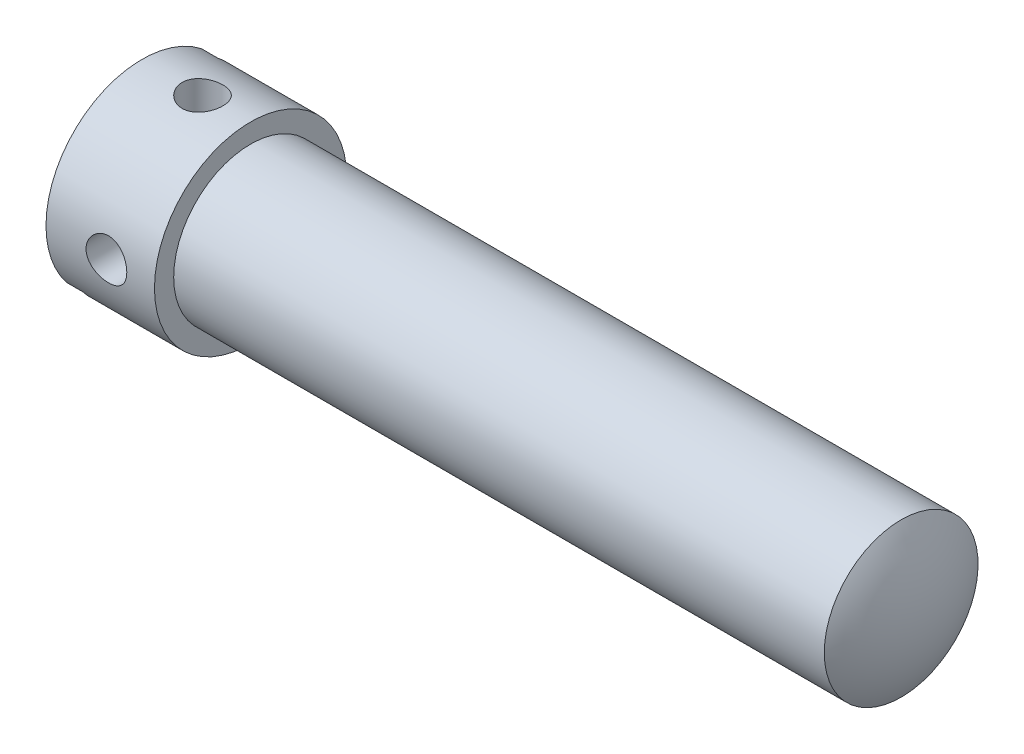
ISO-10303-21;
HEADER;
FILE_DESCRIPTION(('STEP AP214'),'2;1');
FILE_NAME('part.step','',(''),(''),'','','');
FILE_SCHEMA(('AUTOMOTIVE_DESIGN { 1 0 10303 214 1 1 1 1 }'));
ENDSEC;
DATA;
#1=APPLICATION_CONTEXT('core data for automotive mechanical design processes');
#2=APPLICATION_PROTOCOL_DEFINITION('international standard','automotive_design',2000,#1);
#3=PRODUCT_CONTEXT('',#1,'mechanical');
#4=PRODUCT('Part','Part','',(#3));
#5=PRODUCT_RELATED_PRODUCT_CATEGORY('part','',(#4));
#6=PRODUCT_DEFINITION_FORMATION('','',#4);
#7=PRODUCT_DEFINITION_CONTEXT('part definition',#1,'design');
#8=PRODUCT_DEFINITION('design','',#6,#7);
#9=PRODUCT_DEFINITION_SHAPE('','',#8);
#10=(LENGTH_UNIT() NAMED_UNIT(*) SI_UNIT(.MILLI.,.METRE.));
#11=(NAMED_UNIT(*) PLANE_ANGLE_UNIT() SI_UNIT($,.RADIAN.));
#12=(NAMED_UNIT(*) SI_UNIT($,.STERADIAN.) SOLID_ANGLE_UNIT());
#13=UNCERTAINTY_MEASURE_WITH_UNIT(LENGTH_MEASURE(1.E-05),#10,'distance_accuracy_value','');
#14=(GEOMETRIC_REPRESENTATION_CONTEXT(3) GLOBAL_UNCERTAINTY_ASSIGNED_CONTEXT((#13)) GLOBAL_UNIT_ASSIGNED_CONTEXT((#10,
#11,#12)) REPRESENTATION_CONTEXT('',''));
#15=CARTESIAN_POINT('',(0.,0.,0.));
#16=DIRECTION('',(0.,0.,1.));
#17=DIRECTION('',(1.,0.,0.));
#18=AXIS2_PLACEMENT_3D('',#15,#16,#17);
#19=CARTESIAN_POINT('',(12.5255923651299,-1.80873382528711E-06,1.02256343965393E-06));
#20=DIRECTION('',(-1.,0.,0.));
#21=DIRECTION('',(0.,1.,0.));
#22=AXIS2_PLACEMENT_3D('',#19,#20,#21);
#23=SPHERICAL_SURFACE('',#22,22.5);
#24=CARTESIAN_POINT('',(-8.68761107046652,-1.80873382528711E-06,1.02256343965393E-06));
#25=DIRECTION('',(-1.,0.,0.));
#26=DIRECTION('',(0.,0.,1.));
#27=AXIS2_PLACEMENT_3D('',#24,#25,#26);
#28=CIRCLE('',#27,7.5);
#29=CARTESIAN_POINT('',(-8.68761107046652,-4.62858433810122,5.90137575806659));
#30=VERTEX_POINT('',#29);
#31=CARTESIAN_POINT('',(-8.68761107046652,5.90137292676935,-4.62858150680394));
#32=VERTEX_POINT('',#31);
#33=EDGE_CURVE('E179',#30,#32,#28,.T.);
#34=ORIENTED_EDGE('',*,*,#33,.T.);
#35=CARTESIAN_POINT('',(12.5255923651299,0.636394294334063,0.636397125631331));
#36=DIRECTION('',(0.,0.707106781186546,0.707106781186549));
#37=DIRECTION('',(0.,-0.707106781186549,0.707106781186546));
#38=AXIS2_PLACEMENT_3D('',#35,#36,#37);
#39=CIRCLE('',#38,22.4819927942342);
#40=EDGE_CURVE('E200',#32,#30,#39,.T.);
#41=ORIENTED_EDGE('',*,*,#40,.T.);
#42=EDGE_LOOP('',(#34,#41));
#43=FACE_BOUND('',#42,.T.);
#44=ADVANCED_FACE('F39',(#43),#23,.T.);
#45=CARTESIAN_POINT('',(-3.9744076348701,-1.80873382528711E-06,-104.999998977437));
#46=DIRECTION('',(0.,0.,1.));
#47=DIRECTION('',(1.,0.,0.));
#48=AXIS2_PLACEMENT_3D('',#45,#46,#47);
#49=CYLINDRICAL_SURFACE('',#48,1.59);
#50=CARTESIAN_POINT('',(-2.3844076348701,-1.80873382528711E-06,7.50000102256344));
#51=CARTESIAN_POINT('',(-2.38441073898803,-0.088254401886171,7.49999938911071));
#52=CARTESIAN_POINT('',(-2.39178011044394,-0.176545128764989,7.4984274306827));
#53=CARTESIAN_POINT('',(-2.42103494369538,-0.350623227488517,7.49230833111322));
#54=CARTESIAN_POINT('',(-2.44293120603099,-0.436408687120695,7.48775897635331));
#55=CARTESIAN_POINT('',(-2.50052677275435,-0.60293489584506,7.47619216107444));
#56=CARTESIAN_POINT('',(-2.5362120977931,-0.683680658192716,7.4691772008348));
#57=CARTESIAN_POINT('',(-2.62032947240995,-0.838035017028102,7.45343830215929));
#58=CARTESIAN_POINT('',(-2.66876103521309,-0.911643885924775,7.44471442898952));
#59=CARTESIAN_POINT('',(-2.7777718607256,-1.05075223161289,7.42636749472083));
#60=CARTESIAN_POINT('',(-2.83850688441345,-1.11612826306031,7.41673384818194));
#61=CARTESIAN_POINT('',(-2.97006602815569,-1.23584530589926,7.39772861075784));
#62=CARTESIAN_POINT('',(-3.04089100433876,-1.29018537994397,7.38835704219065));
#63=CARTESIAN_POINT('',(-3.19152320019655,-1.38682555808829,7.3708330645186));
#64=CARTESIAN_POINT('',(-3.2714156036173,-1.42899556980312,7.36269424087368));
#65=CARTESIAN_POINT('',(-3.43735361349963,-1.4992644892865,7.34870862887407));
#66=CARTESIAN_POINT('',(-3.52339853064787,-1.52736497055835,7.3428615842281));
#67=CARTESIAN_POINT('',(-3.69786393466929,-1.56829183677486,7.33422911274715));
#68=CARTESIAN_POINT('',(-3.78623111480583,-1.58133606678253,7.33140006600798));
#69=CARTESIAN_POINT('',(-3.96394146216113,-1.59245725402556,7.32899279753772));
#70=CARTESIAN_POINT('',(-4.05328451572747,-1.59053593600841,7.32941420119911));
#71=CARTESIAN_POINT('',(-4.22880053976759,-1.57195617760203,7.33342067701945));
#72=CARTESIAN_POINT('',(-4.31500158789577,-1.55554956208757,7.33695168646955));
#73=CARTESIAN_POINT('',(-4.48339925008536,-1.50886335610542,7.34669417249169));
#74=CARTESIAN_POINT('',(-4.5655956514835,-1.47858302977286,7.35290579124286));
#75=CARTESIAN_POINT('',(-4.72436525426461,-1.40477433398833,7.36736361363425));
#76=CARTESIAN_POINT('',(-4.80089151330661,-1.36114803737326,7.37562476824462));
#77=CARTESIAN_POINT('',(-4.94563086000112,-1.26195473382737,7.39324151322391));
#78=CARTESIAN_POINT('',(-5.01384287794124,-1.2063861929404,7.40259724411844));
#79=CARTESIAN_POINT('',(-5.14146851030237,-1.08354711632986,7.4215817834509));
#80=CARTESIAN_POINT('',(-5.20067567448155,-1.0160621473036,7.43121228241796));
#81=CARTESIAN_POINT('',(-5.30696434014502,-0.872013482816029,7.44948813599959));
#82=CARTESIAN_POINT('',(-5.35404564701184,-0.795449641669523,7.45813347480129));
#83=CARTESIAN_POINT('',(-5.43479238231589,-0.635172984699951,7.47349035912467));
#84=CARTESIAN_POINT('',(-5.46843203438955,-0.551446803593845,7.48019818241511));
#85=CARTESIAN_POINT('',(-5.52110870041885,-0.379356817522301,7.49089638653815));
#86=CARTESIAN_POINT('',(-5.54014770652482,-0.290993646998288,7.49488713808678));
#87=CARTESIAN_POINT('',(-5.56278530777654,-0.113910042014898,7.49964920218916));
#88=CARTESIAN_POINT('',(-5.56666610364134,-0.0252272186436414,7.50047934832106));
#89=CARTESIAN_POINT('',(-5.55964020974181,0.151519553941159,7.49899099846391));
#90=CARTESIAN_POINT('',(-5.54873445919688,0.239583542105059,7.4966727024592));
#91=CARTESIAN_POINT('',(-5.51267923373637,0.411666890217072,7.48918496786787));
#92=CARTESIAN_POINT('',(-5.48767658875274,0.495718406732558,7.48404493414003));
#93=CARTESIAN_POINT('',(-5.42429934938838,0.65843518065561,7.47148856756806));
#94=CARTESIAN_POINT('',(-5.38592366448732,0.737099998172314,7.46407204909117));
#95=CARTESIAN_POINT('',(-5.29629343082568,0.887985877089878,7.44763966865901));
#96=CARTESIAN_POINT('',(-5.24487157737225,0.960105296997114,7.43860351595852));
#97=CARTESIAN_POINT('',(-5.13083034816704,1.09479282536135,7.41997783015382));
#98=CARTESIAN_POINT('',(-5.06820961222441,1.15735977188354,7.41038822992505));
#99=CARTESIAN_POINT('',(-4.93225688362292,1.27227228541081,7.39153503354259));
#100=CARTESIAN_POINT('',(-4.85875883982357,1.32442303830171,7.38227990797847));
#101=CARTESIAN_POINT('',(-4.7038811217313,1.41564083686576,7.36533313492149));
#102=CARTESIAN_POINT('',(-4.62250178074285,1.45470843552164,7.35764142135365));
#103=CARTESIAN_POINT('',(-4.45460021651873,1.51839563493411,7.34476282981504));
#104=CARTESIAN_POINT('',(-4.36810914212821,1.54309444848263,7.33956224726084));
#105=CARTESIAN_POINT('',(-4.1920808592234,1.57757829316339,7.33222834211559));
#106=CARTESIAN_POINT('',(-4.10254410617079,1.58736554428746,7.33009456295009));
#107=CARTESIAN_POINT('',(-3.92492717016505,1.59165844825694,7.32916338137592));
#108=CARTESIAN_POINT('',(-3.83685465416074,1.58647257956462,7.33029862869631));
#109=CARTESIAN_POINT('',(-3.66286861163498,1.5616528301841,7.33562594619107));
#110=CARTESIAN_POINT('',(-3.57695506280117,1.54201909887432,7.33981798476086));
#111=CARTESIAN_POINT('',(-3.40995279019879,1.48900585234316,7.350754704972));
#112=CARTESIAN_POINT('',(-3.32885009172498,1.45566863209429,7.35749152715585));
#113=CARTESIAN_POINT('',(-3.17334223607929,1.37623206807321,7.37276231293525));
#114=CARTESIAN_POINT('',(-3.09893772830163,1.33013148864648,7.38129645051449));
#115=CARTESIAN_POINT('',(-2.95741191716277,1.22544244265055,7.39940328104148));
#116=CARTESIAN_POINT('',(-2.89045614926545,1.16663303586584,7.40899264651443));
#117=CARTESIAN_POINT('',(-2.76726210152643,1.0386466504855,7.42801467414085));
#118=CARTESIAN_POINT('',(-2.71102629551904,0.969467285389264,7.43744729966628));
#119=CARTESIAN_POINT('',(-2.6102240800857,0.821702982853197,7.45522733173326));
#120=CARTESIAN_POINT('',(-2.56580614360198,0.743014936847694,7.46356032286872));
#121=CARTESIAN_POINT('',(-2.49089620429969,0.579132294460774,7.47805867559931));
#122=CARTESIAN_POINT('',(-2.46039219769936,0.493943380845177,7.48422590457277));
#123=CARTESIAN_POINT('',(-2.41978754335659,0.340523665507084,7.49256115725344));
#124=CARTESIAN_POINT('',(-2.40654476983796,0.273139597284188,7.49533418156746));
#125=CARTESIAN_POINT('',(-2.38885378243563,0.137177398958838,7.49905471311382));
#126=CARTESIAN_POINT('',(-2.38440522195538,0.0685993160222286,7.50000229229037));
#127=CARTESIAN_POINT('',(-2.3844076348701,-1.80873382528711E-06,7.50000102256344));
#128=B_SPLINE_CURVE_WITH_KNOTS('',3,(#50,#51,#52,#53,#54,#55,#56,#57,#58,#59,#60,#61,#62,#63,
#64,#65,#66,#67,#68,#69,#70,#71,#72,#73,#74,#75,#76,#77,#78,#79,#80,#81,#82,#83,#84,#85,#86,#87,
#88,#89,#90,#91,#92,#93,#94,#95,#96,#97,#98,#99,#100,#101,#102,#103,#104,#105,#106,#107,#108,
#109,#110,#111,#112,#113,#114,#115,#116,#117,#118,#119,#120,#121,#122,#123,#124,#125,#126,#127),
.UNSPECIFIED.,.T.,.F.,(4,2,2,2,2,2,2,2,2,2,2,2,2,2,2,2,2,2,2,2,2,2,2,2,2,2,2,2,2,2,2,2,2,2,2,2,
2,2,4),(0.,0.264506725802816,0.52921032936916,0.793646277585348,1.05807212853741,
1.3260822139592,1.59411505349531,1.86491506202178,2.13568477814127,2.40248564651716,
2.66925576711724,2.931477485881,3.19371311455616,3.45792104713501,3.72216293697225,
3.99176284095311,4.26136707168623,4.53148585541836,4.80156777687619,5.0665969148179,
5.33160921929248,5.59391090012002,5.85623397565489,6.12210802718587,6.38801439313422,
6.65850501777509,6.92898420820638,7.19795780407314,7.46689135198689,7.73032407337797,
7.99375407114055,8.25637704160014,8.5190254461793,8.7866718205741,9.05437988486648,
9.32530748227593,9.59600090174065,9.8016172291107,10.0072254525913),.UNSPECIFIED.);
#129=CARTESIAN_POINT('',(-2.3844076348701,-1.80873382528711E-06,7.50000102256344));
#130=VERTEX_POINT('',#129);
#131=EDGE_CURVE('E125',#130,#130,#128,.T.);
#132=ORIENTED_EDGE('',*,*,#131,.F.);
#133=EDGE_LOOP('',(#132));
#134=FACE_BOUND('',#133,.T.);
#135=CARTESIAN_POINT('',(-3.9744076348701,-1.80873382528711E-06,1.02256343965393E-06));
#136=DIRECTION('',(0.,-0.707106781186547,0.707106781186547));
#137=DIRECTION('',(0.,0.707106781186547,0.707106781186547));
#138=AXIS2_PLACEMENT_3D('',#135,#136,#137);
#139=ELLIPSE('',#138,2.24859956417322,1.59);
#140=CARTESIAN_POINT('',(-5.5644076348701,-1.80873382528711E-06,1.02256343965393E-06));
#141=VERTEX_POINT('',#140);
#142=CARTESIAN_POINT('',(-2.3844076348701,-1.80873382528711E-06,1.02256343965393E-06));
#143=VERTEX_POINT('',#142);
#144=EDGE_CURVE('E61',#141,#143,#139,.F.);
#145=ORIENTED_EDGE('',*,*,#144,.T.);
#146=CARTESIAN_POINT('',(-3.9744076348701,-1.80873382528711E-06,1.02256343965393E-06));
#147=DIRECTION('',(0.,0.707106781186547,0.707106781186547));
#148=DIRECTION('',(0.,-0.707106781186547,0.707106781186547));
#149=AXIS2_PLACEMENT_3D('',#146,#147,#148);
#150=ELLIPSE('',#149,2.24859956417322,1.59);
#151=EDGE_CURVE('E114',#143,#141,#150,.F.);
#152=ORIENTED_EDGE('',*,*,#151,.T.);
#153=EDGE_LOOP('',(#145,#152));
#154=FACE_BOUND('',#153,.T.);
#155=ADVANCED_FACE('F147',(#134,#154),#49,.F.);
#156=CARTESIAN_POINT('',(-0.224407634870099,7.49999819126618,1.02256343965393E-06));
#157=DIRECTION('',(-1.,0.,0.));
#158=DIRECTION('',(0.,0.,1.));
#159=AXIS2_PLACEMENT_3D('',#156,#157,#158);
#160=PLANE('',#159);
#161=CARTESIAN_POINT('',(-0.224407634870098,-1.80873382528711E-06,1.02256343965393E-06));
#162=DIRECTION('',(-1.,0.,0.));
#163=DIRECTION('',(0.,0.,1.));
#164=AXIS2_PLACEMENT_3D('',#161,#162,#163);
#165=CIRCLE('',#164,7.5);
#166=CARTESIAN_POINT('',(-0.224407634870098,-1.80873382528711E-06,7.50000102256344));
#167=VERTEX_POINT('',#166);
#168=EDGE_CURVE('E178',#167,#167,#165,.T.);
#169=ORIENTED_EDGE('',*,*,#168,.F.);
#170=EDGE_LOOP('',(#169));
#171=FACE_BOUND('',#170,.T.);
#172=CARTESIAN_POINT('',(-0.224407634870098,-1.80873382528711E-06,1.02256343965393E-06));
#173=DIRECTION('',(-1.,0.,0.));
#174=DIRECTION('',(0.,0.,1.));
#175=AXIS2_PLACEMENT_3D('',#172,#173,#174);
#176=CIRCLE('',#175,6.);
#177=CARTESIAN_POINT('',(-0.224407634870098,-1.80873382528711E-06,6.00000102256344));
#178=VERTEX_POINT('',#177);
#179=EDGE_CURVE('E124',#178,#178,#176,.F.);
#180=ORIENTED_EDGE('',*,*,#179,.F.);
#181=EDGE_LOOP('',(#180));
#182=FACE_BOUND('',#181,.T.);
#183=ADVANCED_FACE('F168',(#171,#182),#160,.F.);
#184=CARTESIAN_POINT('',(-8.68761107046652,4.62858072063356,-5.90137371293972));
#185=VERTEX_POINT('',#184);
#186=CARTESIAN_POINT('',(-8.68761107046652,-5.901376544237,4.62858355193082));
#187=VERTEX_POINT('',#186);
#188=EDGE_CURVE('E177',#185,#187,#28,.T.);
#189=ORIENTED_EDGE('',*,*,#188,.T.);
#190=CARTESIAN_POINT('',(12.5255923651299,-0.63639791180171,-0.636395080504447));
#191=DIRECTION('',(0.,-0.707106781186546,-0.707106781186549));
#192=DIRECTION('',(0.,0.707106781186549,-0.707106781186546));
#193=AXIS2_PLACEMENT_3D('',#190,#191,#192);
#194=CIRCLE('',#193,22.4819927942342);
#195=EDGE_CURVE('E91',#187,#185,#194,.T.);
#196=ORIENTED_EDGE('',*,*,#195,.T.);
#197=EDGE_LOOP('',(#189,#196));
#198=FACE_BOUND('',#197,.T.);
#199=ADVANCED_FACE('F41',(#198),#23,.T.);
#200=CARTESIAN_POINT('',(-47.5637228781016,-1.80873382528711E-06,1.02256343965393E-06));
#201=DIRECTION('',(-1.,0.,0.));
#202=DIRECTION('',(0.,0.,1.));
#203=AXIS2_PLACEMENT_3D('',#200,#201,#202);
#204=CYLINDRICAL_SURFACE('',#203,7.5);
#205=CARTESIAN_POINT('',(-3.9744076348701,-7.32952430341245,1.59000102256344));
#206=CARTESIAN_POINT('',(-3.88618016465132,-7.32952608243466,1.58999789995286));
#207=CARTESIAN_POINT('',(-3.79791451355741,-7.33113467049342,1.58263258127027));
#208=CARTESIAN_POINT('',(-3.62388847190626,-7.33738427474022,1.55339530345253));
#209=CARTESIAN_POINT('',(-3.53813001433621,-7.34202756938998,1.53151244434258));
#210=CARTESIAN_POINT('',(-3.3716610098663,-7.35379761017991,1.47395605842925));
#211=CARTESIAN_POINT('',(-3.29094522076053,-7.36092172490589,1.43829713957119));
#212=CARTESIAN_POINT('',(-3.13664145072241,-7.37684754580586,1.35424202289144));
#213=CARTESIAN_POINT('',(-3.06305323110492,-7.38564919577392,1.30584625179813));
#214=CARTESIAN_POINT('',(-2.92392310251952,-7.40409447486384,1.19687222468066));
#215=CARTESIAN_POINT('',(-2.85851082594198,-7.41374831662006,1.13613016424228));
#216=CARTESIAN_POINT('',(-2.73872339200359,-7.43272065274042,1.00454153240757));
#217=CARTESIAN_POINT('',(-2.68434906074092,-7.44203912196182,0.933694205391392));
#218=CARTESIAN_POINT('',(-2.58767180147552,-7.45940160530332,0.783040910514921));
#219=CARTESIAN_POINT('',(-2.54549300911747,-7.46743216673326,0.703153598694144));
#220=CARTESIAN_POINT('',(-2.47520647097724,-7.48119888206992,0.537226583497375));
#221=CARTESIAN_POINT('',(-2.44709724332527,-7.48693527759571,0.451187529141926));
#222=CARTESIAN_POINT('',(-2.40615393759217,-7.49539516267969,0.276746343922136));
#223=CARTESIAN_POINT('',(-2.3931006383682,-7.49816185012764,0.188397796876328));
#224=CARTESIAN_POINT('',(-2.38195484738149,-7.50052008134357,0.0107243976500009));
#225=CARTESIAN_POINT('',(-2.3838607435972,-7.50011196723217,-0.0786003482981863));
#226=CARTESIAN_POINT('',(-2.40241486327733,-7.49619976214499,-0.254181094288175));
#227=CARTESIAN_POINT('',(-2.41882685310066,-7.49274528365732,-0.340463325253798));
#228=CARTESIAN_POINT('',(-2.46555148322685,-7.48318480665561,-0.50902052193183));
#229=CARTESIAN_POINT('',(-2.4958647264194,-7.47707869314222,-0.591295313672595));
#230=CARTESIAN_POINT('',(-2.56974396986427,-7.46282051172457,-0.750164617822047));
#231=CARTESIAN_POINT('',(-2.61340062056374,-7.45465451815652,-0.826715673961486));
#232=CARTESIAN_POINT('',(-2.71266002729665,-7.43717376286106,-0.971492000035221));
#233=CARTESIAN_POINT('',(-2.76826431819327,-7.42785885360281,-1.03971619848569));
#234=CARTESIAN_POINT('',(-2.89113039550247,-7.40889122079698,-1.1673060929047));
#235=CARTESIAN_POINT('',(-2.9585989433647,-7.39923545346774,-1.22647239657256));
#236=CARTESIAN_POINT('',(-3.10259965492381,-7.38084586009595,-1.33268622181081));
#237=CARTESIAN_POINT('',(-3.17913203513387,-7.37211205608631,-1.37973345380044));
#238=CARTESIAN_POINT('',(-3.33939696763987,-7.35654794319477,-1.46045485428237));
#239=CARTESIAN_POINT('',(-3.42314801847883,-7.34972272714978,-1.4940933429054));
#240=CARTESIAN_POINT('',(-3.595292508683,-7.33882054471823,-1.54676022169182));
#241=CARTESIAN_POINT('',(-3.6836852585933,-7.3347431714184,-1.56579077512392));
#242=CARTESIAN_POINT('',(-3.86078750998742,-7.32988079196522,-1.58839647407842));
#243=CARTESIAN_POINT('',(-3.9494584156294,-7.32903413537727,-1.59226106659049));
#244=CARTESIAN_POINT('',(-4.12617759671077,-7.33056304836221,-1.5852070296632));
#245=CARTESIAN_POINT('',(-4.21422591177543,-7.33293841097747,-1.57428934972299));
#246=CARTESIAN_POINT('',(-4.38620564551728,-7.34058567899145,-1.53823123407071));
#247=CARTESIAN_POINT('',(-4.47017167907788,-7.34582545816703,-1.5132484560877));
#248=CARTESIAN_POINT('',(-4.63272617958773,-7.35858248692453,-1.44993922917165));
#249=CARTESIAN_POINT('',(-4.71131415700704,-7.3660999434917,-1.4116115674674));
#250=CARTESIAN_POINT('',(-4.86213946472053,-7.38270187503395,-1.32205641724876));
#251=CARTESIAN_POINT('',(-4.93426792929029,-7.39180753157828,-1.27064958703522));
#252=CARTESIAN_POINT('',(-5.06898058881985,-7.41050320243428,-1.15663162868455));
#253=CARTESIAN_POINT('',(-5.13156367218594,-7.42009327298484,-1.09401919745762));
#254=CARTESIAN_POINT('',(-5.24652292151811,-7.43887928383712,-0.95806139304611));
#255=CARTESIAN_POINT('',(-5.2987023468633,-7.44806545146185,-0.884548090207767));
#256=CARTESIAN_POINT('',(-5.38997041644052,-7.46483255602497,-0.729631054955065));
#257=CARTESIAN_POINT('',(-5.42905965109588,-7.47241356535717,-0.648227678630211));
#258=CARTESIAN_POINT('',(-5.49275901011439,-7.48507477363577,-0.480331820578188));
#259=CARTESIAN_POINT('',(-5.51745754329001,-7.49017021042819,-0.39387408187015));
#260=CARTESIAN_POINT('',(-5.5519520760212,-7.49735185061457,-0.217917061989798));
#261=CARTESIAN_POINT('',(-5.56175010407432,-7.49943846361623,-0.128418196521086));
#262=CARTESIAN_POINT('',(-5.56607893482526,-7.5003561019826,0.0492086664840343));
#263=CARTESIAN_POINT('',(-5.56090421876035,-7.49924992365152,0.137329293265748));
#264=CARTESIAN_POINT('',(-5.536090015188,-7.49403988433907,0.311414558835173));
#265=CARTESIAN_POINT('',(-5.51645075769347,-7.48993607102565,0.397379231884052));
#266=CARTESIAN_POINT('',(-5.46340239824098,-7.47919546468913,0.564500865146734));
#267=CARTESIAN_POINT('',(-5.43003272445003,-7.47256592851983,0.645670836742239));
#268=CARTESIAN_POINT('',(-5.35051015602682,-7.45748394689909,0.801300019014715));
#269=CARTESIAN_POINT('',(-5.30435610314763,-7.44903133629501,0.875758620840435));
#270=CARTESIAN_POINT('',(-5.1996024463918,-7.43103802636441,1.01729526441804));
#271=CARTESIAN_POINT('',(-5.14079440599954,-7.42148052585614,1.08421691839105));
#272=CARTESIAN_POINT('',(-5.01282551036015,-7.40244846696466,1.20734277834688));
#273=CARTESIAN_POINT('',(-4.94366218130239,-7.3929739289747,1.26354441607281));
#274=CARTESIAN_POINT('',(-4.79591612602936,-7.37505026024136,1.36430255910685));
#275=CARTESIAN_POINT('',(-4.71722730528203,-7.36661528966735,1.40870614410202));
#276=CARTESIAN_POINT('',(-4.5533445113527,-7.35190185275791,1.48358904845613));
#277=CARTESIAN_POINT('',(-4.46815626645506,-7.34562151366801,1.51408046758423));
#278=CARTESIAN_POINT('',(-4.31476849825196,-7.33712397694332,1.55465554375996));
#279=CARTESIAN_POINT('',(-4.24741754341165,-7.33429254483458,1.56788531855269));
#280=CARTESIAN_POINT('',(-4.11152125674942,-7.33049205687431,1.58555908213305));
#281=CARTESIAN_POINT('',(-4.04297597650573,-7.32952292079769,1.59000344938389));
#282=CARTESIAN_POINT('',(-3.9744076348701,-7.32952430341245,1.59000102256344));
#283=B_SPLINE_CURVE_WITH_KNOTS('',3,(#205,#206,#207,#208,#209,#210,#211,#212,#213,#214,#215,
#216,#217,#218,#219,#220,#221,#222,#223,#224,#225,#226,#227,#228,#229,#230,#231,#232,#233,#234,
#235,#236,#237,#238,#239,#240,#241,#242,#243,#244,#245,#246,#247,#248,#249,#250,#251,#252,#253,
#254,#255,#256,#257,#258,#259,#260,#261,#262,#263,#264,#265,#266,#267,#268,#269,#270,#271,#272,
#273,#274,#275,#276,#277,#278,#279,#280,#281,#282),.UNSPECIFIED.,.T.,.F.,(4,2,2,2,2,2,2,2,2,2,2,
2,2,2,2,2,2,2,2,2,2,2,2,2,2,2,2,2,2,2,2,2,2,2,2,2,2,2,4),(0.,0.264431202557619,
0.529061168837207,0.793411291939869,1.05775255953104,1.32586145778625,1.59399041436557,
1.86475955958385,2.13550018017446,2.40224684808499,2.66896477143688,2.93141757738986,
3.19388176685313,3.45817024588847,3.72249269727606,3.99198570511743,4.26148515179814,
4.53169700850491,4.80186884219139,5.06685854010016,5.33183121792271,5.5938912779788,
5.85597516004036,6.12186709836099,6.38778997714404,6.65834404922351,6.92888591651853,
7.19774769989621,7.46657287818549,7.73014700675707,7.99371694410374,8.25653524023812,
8.51937735513648,8.78693528918601,9.05455724336135,9.32549522836295,9.59619712032449,
9.8017157657813,10.0072255575857),.UNSPECIFIED.);
#284=CARTESIAN_POINT('',(-3.9744076348701,-7.32952430341245,1.59000102256344));
#285=VERTEX_POINT('',#284);
#286=EDGE_CURVE('E184',#285,#285,#283,.T.);
#287=ORIENTED_EDGE('',*,*,#286,.T.);
#288=EDGE_LOOP('',(#287));
#289=FACE_BOUND('',#288,.T.);
#290=CARTESIAN_POINT('',(-3.9744076348701,7.3295206859448,1.59000102256344));
#291=CARTESIAN_POINT('',(-4.06263510508888,7.32952246496701,1.58999789995286));
#292=CARTESIAN_POINT('',(-4.15090075618278,7.33113105302576,1.58263258127027));
#293=CARTESIAN_POINT('',(-4.32492679783394,7.33738065727257,1.55339530345253));
#294=CARTESIAN_POINT('',(-4.41068525540399,7.34202395192233,1.53151244434258));
#295=CARTESIAN_POINT('',(-4.5771542598739,7.35379399271226,1.47395605842925));
#296=CARTESIAN_POINT('',(-4.65787004897967,7.36091810743824,1.43829713957119));
#297=CARTESIAN_POINT('',(-4.81217381901779,7.37684392833821,1.35424202289144));
#298=CARTESIAN_POINT('',(-4.88576203863528,7.38564557830627,1.30584625179813));
#299=CARTESIAN_POINT('',(-5.02489216722068,7.40409085739619,1.19687222468066));
#300=CARTESIAN_POINT('',(-5.09030444379821,7.41374469915241,1.13613016424228));
#301=CARTESIAN_POINT('',(-5.2100918777366,7.43271703527277,1.00454153240757));
#302=CARTESIAN_POINT('',(-5.26446620899928,7.44203550449417,0.933694205391392));
#303=CARTESIAN_POINT('',(-5.36114346826467,7.45939798783567,0.783040910514921));
#304=CARTESIAN_POINT('',(-5.40332226062273,7.46742854926561,0.703153598694145));
#305=CARTESIAN_POINT('',(-5.47360879876295,7.48119526460227,0.537226583497376));
#306=CARTESIAN_POINT('',(-5.50171802641492,7.48693166012805,0.451187529141927));
#307=CARTESIAN_POINT('',(-5.54266133214802,7.49539154521204,0.276746343922137));
#308=CARTESIAN_POINT('',(-5.55571463137199,7.49815823265999,0.188397796876329));
#309=CARTESIAN_POINT('',(-5.56686042235871,7.50051646387592,0.0107243976500017));
#310=CARTESIAN_POINT('',(-5.564954526143,7.50010834976453,-0.0786003482981857));
#311=CARTESIAN_POINT('',(-5.54640040646287,7.49619614467734,-0.254181094288175));
#312=CARTESIAN_POINT('',(-5.52998841663953,7.49274166618967,-0.340463325253797));
#313=CARTESIAN_POINT('',(-5.48326378651335,7.48318118918796,-0.50902052193183));
#314=CARTESIAN_POINT('',(-5.45295054332079,7.47707507567457,-0.591295313672594));
#315=CARTESIAN_POINT('',(-5.37907129987593,7.46281689425691,-0.750164617822046));
#316=CARTESIAN_POINT('',(-5.33541464917646,7.45465090068887,-0.826715673961484));
#317=CARTESIAN_POINT('',(-5.23615524244355,7.43717014539341,-0.971492000035219));
#318=CARTESIAN_POINT('',(-5.18055095154693,7.42785523613516,-1.03971619848568));
#319=CARTESIAN_POINT('',(-5.05768487423773,7.40888760332932,-1.1673060929047));
#320=CARTESIAN_POINT('',(-4.9902163263755,7.39923183600009,-1.22647239657256));
#321=CARTESIAN_POINT('',(-4.84621561481638,7.3808422426283,-1.33268622181081));
#322=CARTESIAN_POINT('',(-4.76968323460633,7.37210843861866,-1.37973345380044));
#323=CARTESIAN_POINT('',(-4.60941830210033,7.35654432572712,-1.46045485428237));
#324=CARTESIAN_POINT('',(-4.52566725126137,7.34971910968213,-1.4940933429054));
#325=CARTESIAN_POINT('',(-4.35352276105719,7.33881692725058,-1.54676022169182));
#326=CARTESIAN_POINT('',(-4.2651300111469,7.33473955395075,-1.56579077512392));
#327=CARTESIAN_POINT('',(-4.08802775975277,7.32987717449757,-1.58839647407842));
#328=CARTESIAN_POINT('',(-3.9993568541108,7.32903051790962,-1.59226106659049));
#329=CARTESIAN_POINT('',(-3.82263767302943,7.33055943089456,-1.5852070296632));
#330=CARTESIAN_POINT('',(-3.73458935796477,7.33293479350982,-1.57428934972299));
#331=CARTESIAN_POINT('',(-3.56260962422292,7.3405820615238,-1.53823123407071));
#332=CARTESIAN_POINT('',(-3.47864359066232,7.34582184069938,-1.5132484560877));
#333=CARTESIAN_POINT('',(-3.31608909015247,7.35857886945688,-1.44993922917166));
#334=CARTESIAN_POINT('',(-3.23750111273316,7.36609632602404,-1.4116115674674));
#335=CARTESIAN_POINT('',(-3.08667580501967,7.38269825756629,-1.32205641724876));
#336=CARTESIAN_POINT('',(-3.01454734044991,7.39180391411063,-1.27064958703522));
#337=CARTESIAN_POINT('',(-2.87983468092035,7.41049958496663,-1.15663162868455));
#338=CARTESIAN_POINT('',(-2.81725159755426,7.42008965551718,-1.09401919745762));
#339=CARTESIAN_POINT('',(-2.70229234822209,7.43887566636946,-0.95806139304611));
#340=CARTESIAN_POINT('',(-2.6501129228769,7.4480618339942,-0.884548090207768));
#341=CARTESIAN_POINT('',(-2.55884485329967,7.46482893855732,-0.729631054955066));
#342=CARTESIAN_POINT('',(-2.51975561864432,7.47240994788952,-0.648227678630212));
#343=CARTESIAN_POINT('',(-2.45605625962581,7.48507115616812,-0.480331820578189));
#344=CARTESIAN_POINT('',(-2.43135772645019,7.49016659296054,-0.393874081870151));
#345=CARTESIAN_POINT('',(-2.396863193719,7.49734823314692,-0.217917061989799));
#346=CARTESIAN_POINT('',(-2.38706516566587,7.49943484614858,-0.128418196521087));
#347=CARTESIAN_POINT('',(-2.38273633491494,7.50035248451494,0.0492086664840329));
#348=CARTESIAN_POINT('',(-2.38791105097984,7.49924630618387,0.137329293265746));
#349=CARTESIAN_POINT('',(-2.4127252545522,7.49403626687142,0.311414558835171));
#350=CARTESIAN_POINT('',(-2.43236451204673,7.489932453558,0.39737923188405));
#351=CARTESIAN_POINT('',(-2.48541287149922,7.47919184722148,0.564500865146732));
#352=CARTESIAN_POINT('',(-2.51878254529017,7.47256231105218,0.645670836742237));
#353=CARTESIAN_POINT('',(-2.59830511371338,7.45748032943144,0.801300019014713));
#354=CARTESIAN_POINT('',(-2.64445916659257,7.44902771882736,0.875758620840433));
#355=CARTESIAN_POINT('',(-2.7492128233484,7.43103440889676,1.01729526441804));
#356=CARTESIAN_POINT('',(-2.80802086374066,7.42147690838849,1.08421691839105));
#357=CARTESIAN_POINT('',(-2.93598975938005,7.40244484949701,1.20734277834688));
#358=CARTESIAN_POINT('',(-3.0051530884378,7.39297031150705,1.26354441607281));
#359=CARTESIAN_POINT('',(-3.15289914371083,7.37504664277371,1.36430255910685));
#360=CARTESIAN_POINT('',(-3.23158796445817,7.36661167219971,1.40870614410202));
#361=CARTESIAN_POINT('',(-3.3954707583875,7.35189823529026,1.48358904845613));
#362=CARTESIAN_POINT('',(-3.48065900328514,7.34561789620036,1.51408046758423));
#363=CARTESIAN_POINT('',(-3.63404677148823,7.33712035947567,1.55465554375996));
#364=CARTESIAN_POINT('',(-3.70139772632854,7.33428892736693,1.56788531855269));
#365=CARTESIAN_POINT('',(-3.83729401299077,7.33048843940666,1.58555908213305));
#366=CARTESIAN_POINT('',(-3.90583929323447,7.32951930333004,1.59000344938389));
#367=CARTESIAN_POINT('',(-3.9744076348701,7.3295206859448,1.59000102256344));
#368=B_SPLINE_CURVE_WITH_KNOTS('',3,(#290,#291,#292,#293,#294,#295,#296,#297,#298,#299,#300,
#301,#302,#303,#304,#305,#306,#307,#308,#309,#310,#311,#312,#313,#314,#315,#316,#317,#318,#319,
#320,#321,#322,#323,#324,#325,#326,#327,#328,#329,#330,#331,#332,#333,#334,#335,#336,#337,#338,
#339,#340,#341,#342,#343,#344,#345,#346,#347,#348,#349,#350,#351,#352,#353,#354,#355,#356,#357,
#358,#359,#360,#361,#362,#363,#364,#365,#366,#367),.UNSPECIFIED.,.T.,.F.,(4,2,2,2,2,2,2,2,2,2,2,
2,2,2,2,2,2,2,2,2,2,2,2,2,2,2,2,2,2,2,2,2,2,2,2,2,2,2,4),(0.,0.26443120255762,0.529061168837207,
0.793411291939869,1.05775255953104,1.32586145778625,1.59399041436557,1.86475955958385,
2.13550018017446,2.40224684808499,2.66896477143688,2.93141757738986,3.19388176685313,
3.45817024588847,3.72249269727606,3.99198570511743,4.26148515179814,4.5316970085049,
4.80186884219139,5.06685854010016,5.33183121792271,5.59389127797879,5.85597516004036,
6.12186709836099,6.38778997714404,6.6583440492235,6.92888591651853,7.19774769989621,
7.46657287818549,7.73014700675707,7.99371694410374,8.25653524023812,8.51937735513648,
8.786935289186,9.05455724336134,9.32549522836294,9.59619712032448,9.8017157657813,
10.0072255575857),.UNSPECIFIED.);
#369=CARTESIAN_POINT('',(-3.9744076348701,7.3295206859448,1.59000102256344));
#370=VERTEX_POINT('',#369);
#371=EDGE_CURVE('E195',#370,#370,#368,.T.);
#372=ORIENTED_EDGE('',*,*,#371,.T.);
#373=EDGE_LOOP('',(#372));
#374=FACE_BOUND('',#373,.T.);
#375=ORIENTED_EDGE('',*,*,#131,.T.);
#376=EDGE_LOOP('',(#375));
#377=FACE_BOUND('',#376,.T.);
#378=CARTESIAN_POINT('',(-2.3844076348701,-1.80873382528711E-06,-7.49999897743656));
#379=CARTESIAN_POINT('',(-2.38441073898802,0.0882507844185203,-7.49999734398383));
#380=CARTESIAN_POINT('',(-2.39178011044394,0.176541511297338,-7.49842538555582));
#381=CARTESIAN_POINT('',(-2.42103494369538,0.350619610020867,-7.49230628598634));
#382=CARTESIAN_POINT('',(-2.44293120603099,0.436405069653044,-7.48775693122643));
#383=CARTESIAN_POINT('',(-2.50052677275435,0.602931278377409,-7.47619011594756));
#384=CARTESIAN_POINT('',(-2.5362120977931,0.683677040725065,-7.46917515570793));
#385=CARTESIAN_POINT('',(-2.62032947240995,0.838031399560452,-7.45343625703241));
#386=CARTESIAN_POINT('',(-2.66876103521309,0.911640268457124,-7.44471238386264));
#387=CARTESIAN_POINT('',(-2.7777718607256,1.05074861414524,-7.42636544959394));
#388=CARTESIAN_POINT('',(-2.83850688441345,1.11612464559266,-7.41673180305506));
#389=CARTESIAN_POINT('',(-2.97006602815569,1.23584168843161,-7.39772656563096));
#390=CARTESIAN_POINT('',(-3.04089100433876,1.29018176247631,-7.38835499706377));
#391=CARTESIAN_POINT('',(-3.19152320019655,1.38682194062063,-7.37083101939172));
#392=CARTESIAN_POINT('',(-3.2714156036173,1.42899195233547,-7.3626921957468));
#393=CARTESIAN_POINT('',(-3.43735361349963,1.49926087181884,-7.34870658374719));
#394=CARTESIAN_POINT('',(-3.52339853064787,1.5273613530907,-7.34285953910122));
#395=CARTESIAN_POINT('',(-3.69786393466929,1.56828821930721,-7.33422706762027));
#396=CARTESIAN_POINT('',(-3.78623111480583,1.58133244931488,-7.3313980208811));
#397=CARTESIAN_POINT('',(-3.96394146216113,1.59245363655791,-7.32899075241084));
#398=CARTESIAN_POINT('',(-4.05328451572747,1.59053231854076,-7.32941215607223));
#399=CARTESIAN_POINT('',(-4.22880053976759,1.57195256013438,-7.33341863189257));
#400=CARTESIAN_POINT('',(-4.31500158789577,1.55554594461992,-7.33694964134267));
#401=CARTESIAN_POINT('',(-4.48339925008536,1.50885973863777,-7.34669212736481));
#402=CARTESIAN_POINT('',(-4.5655956514835,1.47857941230521,-7.35290374611598));
#403=CARTESIAN_POINT('',(-4.72436525426461,1.40477071652068,-7.36736156850737));
#404=CARTESIAN_POINT('',(-4.80089151330661,1.36114441990561,-7.37562272311774));
#405=CARTESIAN_POINT('',(-4.94563086000112,1.26195111635972,-7.39323946809703));
#406=CARTESIAN_POINT('',(-5.01384287794124,1.20638257547275,-7.40259519899156));
#407=CARTESIAN_POINT('',(-5.14146851030237,1.08354349886221,-7.42157973832402));
#408=CARTESIAN_POINT('',(-5.20067567448155,1.01605852983595,-7.43121023729109));
#409=CARTESIAN_POINT('',(-5.30696434014502,0.872009865348379,-7.44948609087271));
#410=CARTESIAN_POINT('',(-5.35404564701184,0.795446024201873,-7.45813142967441));
#411=CARTESIAN_POINT('',(-5.43479238231589,0.635169367232301,-7.47348831399779));
#412=CARTESIAN_POINT('',(-5.46843203438955,0.551443186126194,-7.48019613728823));
#413=CARTESIAN_POINT('',(-5.52110870041885,0.379353200054651,-7.49089434141127));
#414=CARTESIAN_POINT('',(-5.54014770652482,0.290990029530637,-7.4948850929599));
#415=CARTESIAN_POINT('',(-5.56278530777654,0.113906424547247,-7.49964715706228));
#416=CARTESIAN_POINT('',(-5.56666610364134,0.0252236011759908,-7.50047730319418));
#417=CARTESIAN_POINT('',(-5.55964020974181,-0.151523171408809,-7.49898895333703));
#418=CARTESIAN_POINT('',(-5.54873445919688,-0.239587159572709,-7.49667065733232));
#419=CARTESIAN_POINT('',(-5.51267923373637,-0.411670507684722,-7.48918292274099));
#420=CARTESIAN_POINT('',(-5.48767658875274,-0.495722024200209,-7.48404288901315));
#421=CARTESIAN_POINT('',(-5.42429934938838,-0.658438798123261,-7.47148652244118));
#422=CARTESIAN_POINT('',(-5.38592366448732,-0.737103615639965,-7.46407000396429));
#423=CARTESIAN_POINT('',(-5.29629343082568,-0.887989494557528,-7.44763762353213));
#424=CARTESIAN_POINT('',(-5.24487157737225,-0.960108914464765,-7.43860147083164));
#425=CARTESIAN_POINT('',(-5.13083034816704,-1.094796442829,-7.41997578502694));
#426=CARTESIAN_POINT('',(-5.06820961222441,-1.15736338935119,-7.41038618479817));
#427=CARTESIAN_POINT('',(-4.93225688362292,-1.27227590287846,-7.39153298841571));
#428=CARTESIAN_POINT('',(-4.85875883982357,-1.32442665576936,-7.38227786285159));
#429=CARTESIAN_POINT('',(-4.7038811217313,-1.41564445433341,-7.36533108979461));
#430=CARTESIAN_POINT('',(-4.62250178074285,-1.45471205298929,-7.35763937622677));
#431=CARTESIAN_POINT('',(-4.45460021651873,-1.51839925240177,-7.34476078468816));
#432=CARTESIAN_POINT('',(-4.36810914212821,-1.54309806595028,-7.33956020213396));
#433=CARTESIAN_POINT('',(-4.1920808592234,-1.57758191063104,-7.33222629698871));
#434=CARTESIAN_POINT('',(-4.10254410617079,-1.58736916175511,-7.33009251782321));
#435=CARTESIAN_POINT('',(-3.92492717016505,-1.59166206572459,-7.32916133624904));
#436=CARTESIAN_POINT('',(-3.83685465416074,-1.58647619703227,-7.33029658356943));
#437=CARTESIAN_POINT('',(-3.66286861163498,-1.56165644765175,-7.33562390106419));
#438=CARTESIAN_POINT('',(-3.57695506280117,-1.54202271634197,-7.33981593963398));
#439=CARTESIAN_POINT('',(-3.40995279019879,-1.48900946981081,-7.35075265984512));
#440=CARTESIAN_POINT('',(-3.32885009172498,-1.45567224956194,-7.35748948202898));
#441=CARTESIAN_POINT('',(-3.17334223607929,-1.37623568554086,-7.37276026780837));
#442=CARTESIAN_POINT('',(-3.09893772830163,-1.33013510611413,-7.38129440538761));
#443=CARTESIAN_POINT('',(-2.95741191716277,-1.2254460601182,-7.3994012359146));
#444=CARTESIAN_POINT('',(-2.89045614926545,-1.16663665333349,-7.40899060138755));
#445=CARTESIAN_POINT('',(-2.76726210152643,-1.03865026795315,-7.42801262901397));
#446=CARTESIAN_POINT('',(-2.71102629551904,-0.969470902856914,-7.4374452545394));
#447=CARTESIAN_POINT('',(-2.6102240800857,-0.821706600320847,-7.45522528660638));
#448=CARTESIAN_POINT('',(-2.56580614360198,-0.743018554315344,-7.46355827774184));
#449=CARTESIAN_POINT('',(-2.49089620429969,-0.579135911928425,-7.47805663047243));
#450=CARTESIAN_POINT('',(-2.46039219769936,-0.493946998312827,-7.48422385944589));
#451=CARTESIAN_POINT('',(-2.41978754335659,-0.340527282974734,-7.49255911212656));
#452=CARTESIAN_POINT('',(-2.40654476983796,-0.273143214751839,-7.49533213644058));
#453=CARTESIAN_POINT('',(-2.38885378243563,-0.137181016426489,-7.49905266798695));
#454=CARTESIAN_POINT('',(-2.38440522195538,-0.068602933489879,-7.50000024716349));
#455=CARTESIAN_POINT('',(-2.3844076348701,-1.80873382528711E-06,-7.49999897743656));
#456=B_SPLINE_CURVE_WITH_KNOTS('',3,(#378,#379,#380,#381,#382,#383,#384,#385,#386,#387,#388,
#389,#390,#391,#392,#393,#394,#395,#396,#397,#398,#399,#400,#401,#402,#403,#404,#405,#406,#407,
#408,#409,#410,#411,#412,#413,#414,#415,#416,#417,#418,#419,#420,#421,#422,#423,#424,#425,#426,
#427,#428,#429,#430,#431,#432,#433,#434,#435,#436,#437,#438,#439,#440,#441,#442,#443,#444,#445,
#446,#447,#448,#449,#450,#451,#452,#453,#454,#455),.UNSPECIFIED.,.T.,.F.,(4,2,2,2,2,2,2,2,2,2,2,
2,2,2,2,2,2,2,2,2,2,2,2,2,2,2,2,2,2,2,2,2,2,2,2,2,2,2,4),(0.,0.264506725802816,0.52921032936916,
0.793646277585348,1.05807212853741,1.3260822139592,1.59411505349531,1.86491506202178,
2.13568477814127,2.40248564651716,2.66925576711724,2.931477485881,3.19371311455616,
3.45792104713501,3.72216293697225,3.99176284095311,4.26136707168623,4.53148585541837,
4.80156777687619,5.0665969148179,5.33160921929248,5.59391090012002,5.85623397565489,
6.12210802718588,6.38801439313422,6.65850501777509,6.92898420820638,7.19795780407315,
7.46689135198689,7.73032407337797,7.99375407114055,8.25637704160015,8.5190254461793,
8.7866718205741,9.05437988486648,9.32530748227593,9.59600090174066,9.8016172291107,
10.0072254525914),.UNSPECIFIED.);
#457=CARTESIAN_POINT('',(-2.3844076348701,-1.80873382528711E-06,-7.49999897743656));
#458=VERTEX_POINT('',#457);
#459=EDGE_CURVE('E133',#458,#458,#456,.T.);
#460=ORIENTED_EDGE('',*,*,#459,.T.);
#461=EDGE_LOOP('',(#460));
#462=FACE_BOUND('',#461,.T.);
#463=ORIENTED_EDGE('',*,*,#33,.F.);
#464=DIRECTION('',(-1.,0.,0.));
#465=VECTOR('',#464,1.);
#466=CARTESIAN_POINT('',(-47.5637228781016,-4.62858433810122,5.90137575806659));
#467=LINE('',#466,#465);
#468=CARTESIAN_POINT('',(-7.4244076348701,-4.62858433810122,5.90137575806659));
#469=VERTEX_POINT('',#468);
#470=EDGE_CURVE('E11',#30,#469,#467,.F.);
#471=ORIENTED_EDGE('',*,*,#470,.T.);
#472=CARTESIAN_POINT('',(-7.4244076348701,-1.80873382528711E-06,1.02256343965393E-06));
#473=DIRECTION('',(1.,0.,0.));
#474=DIRECTION('',(0.,0.,-1.));
#475=AXIS2_PLACEMENT_3D('',#472,#473,#474);
#476=CIRCLE('',#475,7.5);
#477=CARTESIAN_POINT('',(-7.4244076348701,-5.901376544237,4.62858355193081));
#478=VERTEX_POINT('',#477);
#479=EDGE_CURVE('E47',#469,#478,#476,.T.);
#480=ORIENTED_EDGE('',*,*,#479,.T.);
#481=DIRECTION('',(-1.,0.,0.));
#482=VECTOR('',#481,1.);
#483=CARTESIAN_POINT('',(-47.5637228781016,-5.901376544237,4.62858355193081));
#484=LINE('',#483,#482);
#485=EDGE_CURVE('E88',#478,#187,#484,.T.);
#486=ORIENTED_EDGE('',*,*,#485,.T.);
#487=ORIENTED_EDGE('',*,*,#188,.F.);
#488=DIRECTION('',(-1.,0.,0.));
#489=VECTOR('',#488,1.);
#490=CARTESIAN_POINT('',(-47.5637228781016,4.62858072063356,-5.90137371293972));
#491=LINE('',#490,#489);
#492=CARTESIAN_POINT('',(-7.4244076348701,4.62858072063356,-5.90137371293972));
#493=VERTEX_POINT('',#492);
#494=EDGE_CURVE('E112',#185,#493,#491,.F.);
#495=ORIENTED_EDGE('',*,*,#494,.T.);
#496=CARTESIAN_POINT('',(-7.4244076348701,5.90137292676934,-4.62858150680393));
#497=VERTEX_POINT('',#496);
#498=EDGE_CURVE('E102',#493,#497,#476,.T.);
#499=ORIENTED_EDGE('',*,*,#498,.T.);
#500=DIRECTION('',(-1.,0.,0.));
#501=VECTOR('',#500,1.);
#502=CARTESIAN_POINT('',(-47.5637228781016,5.90137292676934,-4.62858150680394));
#503=LINE('',#502,#501);
#504=EDGE_CURVE('E96',#497,#32,#503,.T.);
#505=ORIENTED_EDGE('',*,*,#504,.T.);
#506=EDGE_LOOP('',(#463,#471,#480,#486,#487,#495,#499,#505));
#507=FACE_BOUND('',#506,.T.);
#508=ORIENTED_EDGE('',*,*,#168,.T.);
#509=EDGE_LOOP('',(#508));
#510=FACE_BOUND('',#509,.T.);
#511=ADVANCED_FACE('F107',(#289,#374,#377,#462,#507,#510),#204,.T.);
#512=CARTESIAN_POINT('',(52.2755923651128,-1.80873382528711E-06,1.02256343965393E-06));
#513=DIRECTION('',(-1.,0.,0.));
#514=DIRECTION('',(0.,0.,1.));
#515=AXIS2_PLACEMENT_3D('',#512,#513,#514);
#516=CYLINDRICAL_SURFACE('',#515,6.);
#517=CARTESIAN_POINT('',(50.542025520467,-1.80873382528711E-06,1.02256343965393E-06));
#518=DIRECTION('',(-1.,0.,0.));
#519=DIRECTION('',(0.,0.,1.));
#520=AXIS2_PLACEMENT_3D('',#517,#518,#519);
#521=CIRCLE('',#520,6.);
#522=CARTESIAN_POINT('',(50.542025520467,-1.80873382528711E-06,6.00000102256344));
#523=VERTEX_POINT('',#522);
#524=EDGE_CURVE('E132',#523,#523,#521,.T.);
#525=ORIENTED_EDGE('',*,*,#524,.T.);
#526=EDGE_LOOP('',(#525));
#527=FACE_BOUND('',#526,.T.);
#528=ORIENTED_EDGE('',*,*,#179,.T.);
#529=EDGE_LOOP('',(#528));
#530=FACE_BOUND('',#529,.T.);
#531=ADVANCED_FACE('F153',(#527,#530),#516,.T.);
#532=CARTESIAN_POINT('',(41.0255923651299,-1.80873383032303E-06,1.02256343965393E-06));
#533=DIRECTION('',(1.,0.,0.));
#534=DIRECTION('',(0.,1.,0.));
#535=AXIS2_PLACEMENT_3D('',#532,#533,#534);
#536=SPHERICAL_SURFACE('',#535,11.25);
#537=CARTESIAN_POINT('',(52.2755923651299,-1.80873383032303E-06,1.02256343965393E-06));
#538=VERTEX_POINT('',#537);
#539=VERTEX_LOOP('',#538);
#540=FACE_BOUND('',#539,.T.);
#541=ORIENTED_EDGE('',*,*,#524,.F.);
#542=EDGE_LOOP('',(#541));
#543=FACE_BOUND('',#542,.T.);
#544=ADVANCED_FACE('F145',(#540,#543),#536,.T.);
#545=CARTESIAN_POINT('',(-3.9744076348701,-1.80873382528711E-06,1.02256343965393E-06));
#546=DIRECTION('',(0.,-0.707106781186547,0.707106781186547));
#547=DIRECTION('',(0.,0.707106781186547,0.707106781186547));
#548=AXIS2_PLACEMENT_3D('',#545,#546,#547);
#549=ELLIPSE('',#548,2.24859956417322,1.59);
#550=EDGE_CURVE('E120',#141,#143,#549,.T.);
#551=ORIENTED_EDGE('',*,*,#550,.T.);
#552=CARTESIAN_POINT('',(-3.9744076348701,-1.80873382528711E-06,1.02256343965393E-06));
#553=DIRECTION('',(0.,0.707106781186547,0.707106781186547));
#554=DIRECTION('',(0.,-0.707106781186547,0.707106781186547));
#555=AXIS2_PLACEMENT_3D('',#552,#553,#554);
#556=ELLIPSE('',#555,2.24859956417322,1.59);
#557=EDGE_CURVE('E115',#143,#141,#556,.T.);
#558=ORIENTED_EDGE('',*,*,#557,.T.);
#559=EDGE_LOOP('',(#551,#558));
#560=FACE_BOUND('',#559,.T.);
#561=ORIENTED_EDGE('',*,*,#459,.F.);
#562=EDGE_LOOP('',(#561));
#563=FACE_BOUND('',#562,.T.);
#564=ADVANCED_FACE('F139',(#560,#563),#49,.F.);
#565=CARTESIAN_POINT('',(-3.9744076348701,-105.000001808734,1.02256343965393E-06));
#566=DIRECTION('',(0.,1.,0.));
#567=DIRECTION('',(0.,0.,1.));
#568=AXIS2_PLACEMENT_3D('',#565,#566,#567);
#569=CYLINDRICAL_SURFACE('',#568,1.59);
#570=ORIENTED_EDGE('',*,*,#144,.F.);
#571=ORIENTED_EDGE('',*,*,#557,.F.);
#572=EDGE_LOOP('',(#570,#571));
#573=FACE_BOUND('',#572,.T.);
#574=ORIENTED_EDGE('',*,*,#371,.F.);
#575=EDGE_LOOP('',(#574));
#576=FACE_BOUND('',#575,.T.);
#577=ADVANCED_FACE('F144',(#573,#576),#569,.F.);
#578=ORIENTED_EDGE('',*,*,#550,.F.);
#579=ORIENTED_EDGE('',*,*,#151,.F.);
#580=EDGE_LOOP('',(#578,#579));
#581=FACE_BOUND('',#580,.T.);
#582=ORIENTED_EDGE('',*,*,#286,.F.);
#583=EDGE_LOOP('',(#582));
#584=FACE_BOUND('',#583,.T.);
#585=ADVANCED_FACE('F148',(#581,#584),#569,.F.);
#586=CARTESIAN_POINT('',(-9.9744076348701,74.8826063189217,-73.609814898956));
#587=DIRECTION('',(0.,0.707106781186546,0.707106781186549));
#588=DIRECTION('',(0.,-0.707106781186549,0.707106781186546));
#589=AXIS2_PLACEMENT_3D('',#586,#587,#588);
#590=PLANE('',#589);
#591=DIRECTION('',(0.,-0.707106781186549,0.707106781186546));
#592=VECTOR('',#591,1.);
#593=CARTESIAN_POINT('',(-7.4244076348701,74.8826063189217,-73.609814898956));
#594=LINE('',#593,#592);
#595=EDGE_CURVE('E104',#497,#469,#594,.T.);
#596=ORIENTED_EDGE('',*,*,#595,.T.);
#597=ORIENTED_EDGE('',*,*,#470,.F.);
#598=ORIENTED_EDGE('',*,*,#40,.F.);
#599=ORIENTED_EDGE('',*,*,#504,.F.);
#600=EDGE_LOOP('',(#596,#597,#598,#599));
#601=FACE_BOUND('',#600,.T.);
#602=ADVANCED_FACE('F205',(#601),#590,.F.);
#603=CARTESIAN_POINT('',(-7.4244076348701,74.8826063189217,-73.609814898956));
#604=DIRECTION('',(1.,0.,0.));
#605=DIRECTION('',(0.,0.,-1.));
#606=AXIS2_PLACEMENT_3D('',#603,#604,#605);
#607=PLANE('',#606);
#608=DIRECTION('',(0.,-0.707106781186549,0.707106781186546));
#609=VECTOR('',#608,1.);
#610=CARTESIAN_POINT('',(-7.4244076348701,73.6098141127859,-74.8826071050918));
#611=LINE('',#610,#609);
#612=EDGE_CURVE('E54',#493,#478,#611,.T.);
#613=ORIENTED_EDGE('',*,*,#612,.T.);
#614=ORIENTED_EDGE('',*,*,#479,.F.);
#615=ORIENTED_EDGE('',*,*,#595,.F.);
#616=ORIENTED_EDGE('',*,*,#498,.F.);
#617=EDGE_LOOP('',(#613,#614,#615,#616));
#618=FACE_BOUND('',#617,.T.);
#619=ADVANCED_FACE('F98',(#618),#607,.F.);
#620=CARTESIAN_POINT('',(-9.9744076348701,73.6098141127859,-74.8826071050918));
#621=DIRECTION('',(0.,-0.707106781186546,-0.707106781186549));
#622=DIRECTION('',(0.,0.707106781186549,-0.707106781186546));
#623=AXIS2_PLACEMENT_3D('',#620,#621,#622);
#624=PLANE('',#623);
#625=ORIENTED_EDGE('',*,*,#612,.F.);
#626=ORIENTED_EDGE('',*,*,#494,.F.);
#627=ORIENTED_EDGE('',*,*,#195,.F.);
#628=ORIENTED_EDGE('',*,*,#485,.F.);
#629=EDGE_LOOP('',(#625,#626,#627,#628));
#630=FACE_BOUND('',#629,.T.);
#631=ADVANCED_FACE('F89',(#630),#624,.F.);
#632=CLOSED_SHELL('',(#44,#155,#183,#199,#511,#531,#544,#564,#577,#585,#602,#619,#631));
#633=MANIFOLD_SOLID_BREP('B2',#632);
#634=ADVANCED_BREP_SHAPE_REPRESENTATION('',(#18,#633),#14);
#635=SHAPE_DEFINITION_REPRESENTATION(#9,#634);
ENDSEC;
END-ISO-10303-21;
